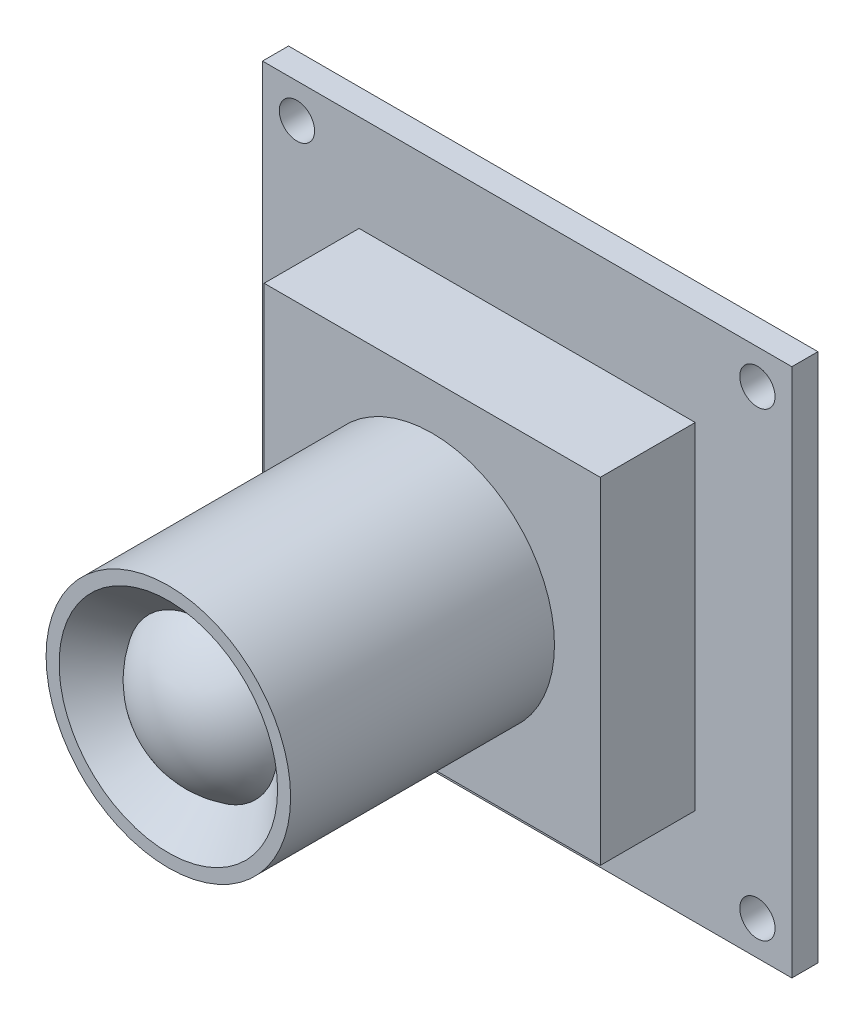
ISO-10303-21;
HEADER;
FILE_DESCRIPTION(('STEP AP214'),'2;1');
FILE_NAME('part.step','',(''),(''),'','','');
FILE_SCHEMA(('AUTOMOTIVE_DESIGN { 1 0 10303 214 1 1 1 1 }'));
ENDSEC;
DATA;
#1=APPLICATION_CONTEXT('core data for automotive mechanical design processes');
#2=APPLICATION_PROTOCOL_DEFINITION('international standard','automotive_design',2000,#1);
#3=PRODUCT_CONTEXT('',#1,'mechanical');
#4=PRODUCT('Part','Part','',(#3));
#5=PRODUCT_RELATED_PRODUCT_CATEGORY('part','',(#4));
#6=PRODUCT_DEFINITION_FORMATION('','',#4);
#7=PRODUCT_DEFINITION_CONTEXT('part definition',#1,'design');
#8=PRODUCT_DEFINITION('design','',#6,#7);
#9=PRODUCT_DEFINITION_SHAPE('','',#8);
#10=(LENGTH_UNIT() NAMED_UNIT(*) SI_UNIT(.MILLI.,.METRE.));
#11=(NAMED_UNIT(*) PLANE_ANGLE_UNIT() SI_UNIT($,.RADIAN.));
#12=(NAMED_UNIT(*) SI_UNIT($,.STERADIAN.) SOLID_ANGLE_UNIT());
#13=UNCERTAINTY_MEASURE_WITH_UNIT(LENGTH_MEASURE(1.E-05),#10,'distance_accuracy_value','');
#14=(GEOMETRIC_REPRESENTATION_CONTEXT(3) GLOBAL_UNCERTAINTY_ASSIGNED_CONTEXT((#13)) GLOBAL_UNIT_ASSIGNED_CONTEXT((#10,
#11,#12)) REPRESENTATION_CONTEXT('',''));
#15=CARTESIAN_POINT('',(0.,0.,0.));
#16=DIRECTION('',(0.,0.,1.));
#17=DIRECTION('',(1.,0.,0.));
#18=AXIS2_PLACEMENT_3D('',#15,#16,#17);
#19=CARTESIAN_POINT('',(0.,0.,7.3152));
#20=DIRECTION('',(0.,0.,1.));
#21=DIRECTION('',(1.,0.,0.));
#22=AXIS2_PLACEMENT_3D('',#19,#20,#21);
#23=PLANE('',#22);
#24=DIRECTION('',(0.,1.,0.));
#25=VECTOR('',#24,1.);
#26=CARTESIAN_POINT('',(10.16,10.16,7.3152));
#27=LINE('',#26,#25);
#28=CARTESIAN_POINT('',(10.16,-10.16,7.3152));
#29=VERTEX_POINT('',#28);
#30=CARTESIAN_POINT('',(10.16,10.16,7.3152));
#31=VERTEX_POINT('',#30);
#32=EDGE_CURVE('E121',#29,#31,#27,.T.);
#33=ORIENTED_EDGE('',*,*,#32,.T.);
#34=DIRECTION('',(-1.,0.,0.));
#35=VECTOR('',#34,1.);
#36=CARTESIAN_POINT('',(-10.16,10.16,7.3152));
#37=LINE('',#36,#35);
#38=CARTESIAN_POINT('',(-10.16,10.16,7.3152));
#39=VERTEX_POINT('',#38);
#40=EDGE_CURVE('E110',#31,#39,#37,.T.);
#41=ORIENTED_EDGE('',*,*,#40,.T.);
#42=DIRECTION('',(0.,-1.,0.));
#43=VECTOR('',#42,1.);
#44=CARTESIAN_POINT('',(-10.16,10.16,7.3152));
#45=LINE('',#44,#43);
#46=CARTESIAN_POINT('',(-10.16,-10.16,7.3152));
#47=VERTEX_POINT('',#46);
#48=EDGE_CURVE('E120',#39,#47,#45,.T.);
#49=ORIENTED_EDGE('',*,*,#48,.T.);
#50=DIRECTION('',(1.,0.,0.));
#51=VECTOR('',#50,1.);
#52=CARTESIAN_POINT('',(-10.16,-10.16,7.3152));
#53=LINE('',#52,#51);
#54=EDGE_CURVE('E125',#47,#29,#53,.T.);
#55=ORIENTED_EDGE('',*,*,#54,.T.);
#56=EDGE_LOOP('',(#33,#41,#49,#55));
#57=FACE_BOUND('',#56,.T.);
#58=CARTESIAN_POINT('',(0.,0.,7.3152));
#59=DIRECTION('',(0.,0.,1.));
#60=DIRECTION('',(1.,0.,0.));
#61=AXIS2_PLACEMENT_3D('',#58,#59,#60);
#62=CIRCLE('',#61,7.3914);
#63=CARTESIAN_POINT('',(7.3914,0.,7.3152));
#64=VERTEX_POINT('',#63);
#65=EDGE_CURVE('E165',#64,#64,#62,.T.);
#66=ORIENTED_EDGE('',*,*,#65,.F.);
#67=EDGE_LOOP('',(#66));
#68=FACE_BOUND('',#67,.T.);
#69=ADVANCED_FACE('F35',(#57,#68),#23,.T.);
#70=CARTESIAN_POINT('',(0.,0.,1.5748));
#71=DIRECTION('',(0.,0.,1.));
#72=DIRECTION('',(1.,0.,0.));
#73=AXIS2_PLACEMENT_3D('',#70,#71,#72);
#74=PLANE('',#73);
#75=CARTESIAN_POINT('',(13.9192,-13.9192,1.5748));
#76=DIRECTION('',(0.,0.,1.));
#77=DIRECTION('',(1.,0.,0.));
#78=AXIS2_PLACEMENT_3D('',#75,#76,#77);
#79=CIRCLE('',#78,1.0668);
#80=CARTESIAN_POINT('',(14.986,-13.9192,1.5748));
#81=VERTEX_POINT('',#80);
#82=EDGE_CURVE('E177',#81,#81,#79,.T.);
#83=ORIENTED_EDGE('',*,*,#82,.F.);
#84=EDGE_LOOP('',(#83));
#85=FACE_BOUND('',#84,.T.);
#86=CARTESIAN_POINT('',(13.9192,13.9192,1.5748));
#87=DIRECTION('',(0.,0.,1.));
#88=DIRECTION('',(1.,0.,0.));
#89=AXIS2_PLACEMENT_3D('',#86,#87,#88);
#90=CIRCLE('',#89,1.0668);
#91=CARTESIAN_POINT('',(14.986,13.9192,1.5748));
#92=VERTEX_POINT('',#91);
#93=EDGE_CURVE('E174',#92,#92,#90,.T.);
#94=ORIENTED_EDGE('',*,*,#93,.F.);
#95=EDGE_LOOP('',(#94));
#96=FACE_BOUND('',#95,.T.);
#97=CARTESIAN_POINT('',(-13.9192,-13.9192,1.5748));
#98=DIRECTION('',(0.,0.,1.));
#99=DIRECTION('',(1.,0.,0.));
#100=AXIS2_PLACEMENT_3D('',#97,#98,#99);
#101=CIRCLE('',#100,1.0668);
#102=CARTESIAN_POINT('',(-12.8524,-13.9192,1.5748));
#103=VERTEX_POINT('',#102);
#104=EDGE_CURVE('E170',#103,#103,#101,.T.);
#105=ORIENTED_EDGE('',*,*,#104,.F.);
#106=EDGE_LOOP('',(#105));
#107=FACE_BOUND('',#106,.T.);
#108=CARTESIAN_POINT('',(-13.9192,13.9192,1.5748));
#109=DIRECTION('',(0.,0.,1.));
#110=DIRECTION('',(1.,0.,0.));
#111=AXIS2_PLACEMENT_3D('',#108,#109,#110);
#112=CIRCLE('',#111,1.0668);
#113=CARTESIAN_POINT('',(-12.8524,13.9192,1.5748));
#114=VERTEX_POINT('',#113);
#115=EDGE_CURVE('E166',#114,#114,#112,.T.);
#116=ORIENTED_EDGE('',*,*,#115,.F.);
#117=EDGE_LOOP('',(#116));
#118=FACE_BOUND('',#117,.T.);
#119=DIRECTION('',(0.,1.,0.));
#120=VECTOR('',#119,1.);
#121=CARTESIAN_POINT('',(16.002,16.002,1.5748));
#122=LINE('',#121,#120);
#123=CARTESIAN_POINT('',(16.002,-16.002,1.5748));
#124=VERTEX_POINT('',#123);
#125=CARTESIAN_POINT('',(16.002,16.002,1.5748));
#126=VERTEX_POINT('',#125);
#127=EDGE_CURVE('E143',#124,#126,#122,.T.);
#128=ORIENTED_EDGE('',*,*,#127,.T.);
#129=DIRECTION('',(-1.,0.,0.));
#130=VECTOR('',#129,1.);
#131=CARTESIAN_POINT('',(-16.002,16.002,1.5748));
#132=LINE('',#131,#130);
#133=CARTESIAN_POINT('',(-16.002,16.002,1.5748));
#134=VERTEX_POINT('',#133);
#135=EDGE_CURVE('E88',#126,#134,#132,.T.);
#136=ORIENTED_EDGE('',*,*,#135,.T.);
#137=DIRECTION('',(0.,-1.,0.));
#138=VECTOR('',#137,1.);
#139=CARTESIAN_POINT('',(-16.002,16.002,1.5748));
#140=LINE('',#139,#138);
#141=CARTESIAN_POINT('',(-16.002,-16.002,1.5748));
#142=VERTEX_POINT('',#141);
#143=EDGE_CURVE('E146',#134,#142,#140,.T.);
#144=ORIENTED_EDGE('',*,*,#143,.T.);
#145=DIRECTION('',(1.,0.,0.));
#146=VECTOR('',#145,1.);
#147=CARTESIAN_POINT('',(-16.002,-16.002,1.5748));
#148=LINE('',#147,#146);
#149=EDGE_CURVE('E59',#142,#124,#148,.T.);
#150=ORIENTED_EDGE('',*,*,#149,.T.);
#151=EDGE_LOOP('',(#128,#136,#144,#150));
#152=FACE_BOUND('',#151,.T.);
#153=DIRECTION('',(-1.,0.,0.));
#154=VECTOR('',#153,1.);
#155=CARTESIAN_POINT('',(-10.16,10.16,1.5748));
#156=LINE('',#155,#154);
#157=CARTESIAN_POINT('',(10.16,10.16,1.5748));
#158=VERTEX_POINT('',#157);
#159=CARTESIAN_POINT('',(-10.16,10.16,1.5748));
#160=VERTEX_POINT('',#159);
#161=EDGE_CURVE('E248',#158,#160,#156,.T.);
#162=ORIENTED_EDGE('',*,*,#161,.F.);
#163=DIRECTION('',(0.,1.,0.));
#164=VECTOR('',#163,1.);
#165=CARTESIAN_POINT('',(10.16,10.16,1.5748));
#166=LINE('',#165,#164);
#167=CARTESIAN_POINT('',(10.16,-10.16,1.5748));
#168=VERTEX_POINT('',#167);
#169=EDGE_CURVE('E133',#168,#158,#166,.T.);
#170=ORIENTED_EDGE('',*,*,#169,.F.);
#171=DIRECTION('',(1.,0.,0.));
#172=VECTOR('',#171,1.);
#173=CARTESIAN_POINT('',(-10.16,-10.16,1.5748));
#174=LINE('',#173,#172);
#175=CARTESIAN_POINT('',(-10.16,-10.16,1.5748));
#176=VERTEX_POINT('',#175);
#177=EDGE_CURVE('E129',#176,#168,#174,.T.);
#178=ORIENTED_EDGE('',*,*,#177,.F.);
#179=DIRECTION('',(0.,-1.,0.));
#180=VECTOR('',#179,1.);
#181=CARTESIAN_POINT('',(-10.16,10.16,1.5748));
#182=LINE('',#181,#180);
#183=EDGE_CURVE('E250',#160,#176,#182,.T.);
#184=ORIENTED_EDGE('',*,*,#183,.F.);
#185=EDGE_LOOP('',(#162,#170,#178,#184));
#186=FACE_BOUND('',#185,.T.);
#187=ADVANCED_FACE('F198',(#85,#96,#107,#118,#152,#186),#74,.T.);
#188=CARTESIAN_POINT('',(16.002,16.002,1.5748));
#189=DIRECTION('',(-1.,0.,0.));
#190=DIRECTION('',(0.,0.,1.));
#191=AXIS2_PLACEMENT_3D('',#188,#189,#190);
#192=PLANE('',#191);
#193=DIRECTION('',(0.,1.,0.));
#194=VECTOR('',#193,1.);
#195=CARTESIAN_POINT('',(16.002,16.002,0.));
#196=LINE('',#195,#194);
#197=CARTESIAN_POINT('',(16.002,-16.002,0.));
#198=VERTEX_POINT('',#197);
#199=CARTESIAN_POINT('',(16.002,16.002,0.));
#200=VERTEX_POINT('',#199);
#201=EDGE_CURVE('E135',#198,#200,#196,.T.);
#202=ORIENTED_EDGE('',*,*,#201,.T.);
#203=DIRECTION('',(0.,0.,-1.));
#204=VECTOR('',#203,1.);
#205=CARTESIAN_POINT('',(16.002,16.002,1.5748));
#206=LINE('',#205,#204);
#207=EDGE_CURVE('E160',#126,#200,#206,.T.);
#208=ORIENTED_EDGE('',*,*,#207,.F.);
#209=ORIENTED_EDGE('',*,*,#127,.F.);
#210=DIRECTION('',(0.,0.,-1.));
#211=VECTOR('',#210,1.);
#212=CARTESIAN_POINT('',(16.002,-16.002,1.5748));
#213=LINE('',#212,#211);
#214=EDGE_CURVE('E148',#124,#198,#213,.T.);
#215=ORIENTED_EDGE('',*,*,#214,.T.);
#216=EDGE_LOOP('',(#202,#208,#209,#215));
#217=FACE_BOUND('',#216,.T.);
#218=ADVANCED_FACE('F203',(#217),#192,.F.);
#219=CARTESIAN_POINT('',(-16.002,16.002,1.5748));
#220=DIRECTION('',(0.,-1.,0.));
#221=DIRECTION('',(0.,0.,-1.));
#222=AXIS2_PLACEMENT_3D('',#219,#220,#221);
#223=PLANE('',#222);
#224=DIRECTION('',(-1.,0.,0.));
#225=VECTOR('',#224,1.);
#226=CARTESIAN_POINT('',(-16.002,16.002,0.));
#227=LINE('',#226,#225);
#228=CARTESIAN_POINT('',(-16.002,16.002,0.));
#229=VERTEX_POINT('',#228);
#230=EDGE_CURVE('E138',#200,#229,#227,.T.);
#231=ORIENTED_EDGE('',*,*,#230,.T.);
#232=DIRECTION('',(0.,0.,-1.));
#233=VECTOR('',#232,1.);
#234=CARTESIAN_POINT('',(-16.002,16.002,1.5748));
#235=LINE('',#234,#233);
#236=EDGE_CURVE('E157',#134,#229,#235,.T.);
#237=ORIENTED_EDGE('',*,*,#236,.F.);
#238=ORIENTED_EDGE('',*,*,#135,.F.);
#239=ORIENTED_EDGE('',*,*,#207,.T.);
#240=EDGE_LOOP('',(#231,#237,#238,#239));
#241=FACE_BOUND('',#240,.T.);
#242=ADVANCED_FACE('F231',(#241),#223,.F.);
#243=CARTESIAN_POINT('',(-16.002,16.002,1.5748));
#244=DIRECTION('',(1.,0.,0.));
#245=DIRECTION('',(0.,1.,0.));
#246=AXIS2_PLACEMENT_3D('',#243,#244,#245);
#247=PLANE('',#246);
#248=DIRECTION('',(0.,-1.,0.));
#249=VECTOR('',#248,1.);
#250=CARTESIAN_POINT('',(-16.002,16.002,0.));
#251=LINE('',#250,#249);
#252=CARTESIAN_POINT('',(-16.002,-16.002,0.));
#253=VERTEX_POINT('',#252);
#254=EDGE_CURVE('E151',#229,#253,#251,.T.);
#255=ORIENTED_EDGE('',*,*,#254,.T.);
#256=DIRECTION('',(0.,0.,-1.));
#257=VECTOR('',#256,1.);
#258=CARTESIAN_POINT('',(-16.002,-16.002,1.5748));
#259=LINE('',#258,#257);
#260=EDGE_CURVE('E155',#142,#253,#259,.T.);
#261=ORIENTED_EDGE('',*,*,#260,.F.);
#262=ORIENTED_EDGE('',*,*,#143,.F.);
#263=ORIENTED_EDGE('',*,*,#236,.T.);
#264=EDGE_LOOP('',(#255,#261,#262,#263));
#265=FACE_BOUND('',#264,.T.);
#266=ADVANCED_FACE('F228',(#265),#247,.F.);
#267=CARTESIAN_POINT('',(-16.002,-16.002,1.5748));
#268=DIRECTION('',(0.,1.,0.));
#269=DIRECTION('',(0.,0.,1.));
#270=AXIS2_PLACEMENT_3D('',#267,#268,#269);
#271=PLANE('',#270);
#272=DIRECTION('',(1.,0.,0.));
#273=VECTOR('',#272,1.);
#274=CARTESIAN_POINT('',(-16.002,-16.002,0.));
#275=LINE('',#274,#273);
#276=EDGE_CURVE('E80',#253,#198,#275,.T.);
#277=ORIENTED_EDGE('',*,*,#276,.T.);
#278=ORIENTED_EDGE('',*,*,#214,.F.);
#279=ORIENTED_EDGE('',*,*,#149,.F.);
#280=ORIENTED_EDGE('',*,*,#260,.T.);
#281=EDGE_LOOP('',(#277,#278,#279,#280));
#282=FACE_BOUND('',#281,.T.);
#283=ADVANCED_FACE('F224',(#282),#271,.F.);
#284=CARTESIAN_POINT('',(0.,0.,0.));
#285=DIRECTION('',(0.,0.,1.));
#286=DIRECTION('',(1.,0.,0.));
#287=AXIS2_PLACEMENT_3D('',#284,#285,#286);
#288=PLANE('',#287);
#289=CARTESIAN_POINT('',(13.9192,-13.9192,0.));
#290=DIRECTION('',(0.,0.,1.));
#291=DIRECTION('',(1.,0.,0.));
#292=AXIS2_PLACEMENT_3D('',#289,#290,#291);
#293=CIRCLE('',#292,1.0668);
#294=CARTESIAN_POINT('',(14.986,-13.9192,0.));
#295=VERTEX_POINT('',#294);
#296=EDGE_CURVE('E175',#295,#295,#293,.T.);
#297=ORIENTED_EDGE('',*,*,#296,.T.);
#298=EDGE_LOOP('',(#297));
#299=FACE_BOUND('',#298,.T.);
#300=CARTESIAN_POINT('',(13.9192,13.9192,0.));
#301=DIRECTION('',(0.,0.,1.));
#302=DIRECTION('',(1.,0.,0.));
#303=AXIS2_PLACEMENT_3D('',#300,#301,#302);
#304=CIRCLE('',#303,1.0668);
#305=CARTESIAN_POINT('',(14.986,13.9192,0.));
#306=VERTEX_POINT('',#305);
#307=EDGE_CURVE('E171',#306,#306,#304,.T.);
#308=ORIENTED_EDGE('',*,*,#307,.T.);
#309=EDGE_LOOP('',(#308));
#310=FACE_BOUND('',#309,.T.);
#311=CARTESIAN_POINT('',(-13.9192,-13.9192,0.));
#312=DIRECTION('',(0.,0.,1.));
#313=DIRECTION('',(1.,0.,0.));
#314=AXIS2_PLACEMENT_3D('',#311,#312,#313);
#315=CIRCLE('',#314,1.0668);
#316=CARTESIAN_POINT('',(-12.8524,-13.9192,0.));
#317=VERTEX_POINT('',#316);
#318=EDGE_CURVE('E167',#317,#317,#315,.T.);
#319=ORIENTED_EDGE('',*,*,#318,.T.);
#320=EDGE_LOOP('',(#319));
#321=FACE_BOUND('',#320,.T.);
#322=CARTESIAN_POINT('',(-13.9192,13.9192,0.));
#323=DIRECTION('',(0.,0.,1.));
#324=DIRECTION('',(1.,0.,0.));
#325=AXIS2_PLACEMENT_3D('',#322,#323,#324);
#326=CIRCLE('',#325,1.0668);
#327=CARTESIAN_POINT('',(-12.8524,13.9192,0.));
#328=VERTEX_POINT('',#327);
#329=EDGE_CURVE('E162',#328,#328,#326,.T.);
#330=ORIENTED_EDGE('',*,*,#329,.T.);
#331=EDGE_LOOP('',(#330));
#332=FACE_BOUND('',#331,.T.);
#333=ORIENTED_EDGE('',*,*,#201,.F.);
#334=ORIENTED_EDGE('',*,*,#276,.F.);
#335=ORIENTED_EDGE('',*,*,#254,.F.);
#336=ORIENTED_EDGE('',*,*,#230,.F.);
#337=EDGE_LOOP('',(#333,#334,#335,#336));
#338=FACE_BOUND('',#337,.T.);
#339=ADVANCED_FACE('F220',(#299,#310,#321,#332,#338),#288,.F.);
#340=CARTESIAN_POINT('',(10.16,10.16,7.3152));
#341=DIRECTION('',(-1.,0.,0.));
#342=DIRECTION('',(0.,-1.,0.));
#343=AXIS2_PLACEMENT_3D('',#340,#341,#342);
#344=PLANE('',#343);
#345=ORIENTED_EDGE('',*,*,#169,.T.);
#346=DIRECTION('',(0.,0.,-1.));
#347=VECTOR('',#346,1.);
#348=CARTESIAN_POINT('',(10.16,10.16,7.3152));
#349=LINE('',#348,#347);
#350=EDGE_CURVE('E114',#31,#158,#349,.T.);
#351=ORIENTED_EDGE('',*,*,#350,.F.);
#352=ORIENTED_EDGE('',*,*,#32,.F.);
#353=DIRECTION('',(0.,0.,-1.));
#354=VECTOR('',#353,1.);
#355=CARTESIAN_POINT('',(10.16,-10.16,7.3152));
#356=LINE('',#355,#354);
#357=EDGE_CURVE('E258',#29,#168,#356,.T.);
#358=ORIENTED_EDGE('',*,*,#357,.T.);
#359=EDGE_LOOP('',(#345,#351,#352,#358));
#360=FACE_BOUND('',#359,.T.);
#361=ADVANCED_FACE('F131',(#360),#344,.F.);
#362=CARTESIAN_POINT('',(-10.16,10.16,7.3152));
#363=DIRECTION('',(0.,-1.,0.));
#364=DIRECTION('',(0.,0.,-1.));
#365=AXIS2_PLACEMENT_3D('',#362,#363,#364);
#366=PLANE('',#365);
#367=ORIENTED_EDGE('',*,*,#161,.T.);
#368=DIRECTION('',(0.,0.,-1.));
#369=VECTOR('',#368,1.);
#370=CARTESIAN_POINT('',(-10.16,10.16,7.3152));
#371=LINE('',#370,#369);
#372=EDGE_CURVE('E117',#39,#160,#371,.T.);
#373=ORIENTED_EDGE('',*,*,#372,.F.);
#374=ORIENTED_EDGE('',*,*,#40,.F.);
#375=ORIENTED_EDGE('',*,*,#350,.T.);
#376=EDGE_LOOP('',(#367,#373,#374,#375));
#377=FACE_BOUND('',#376,.T.);
#378=ADVANCED_FACE('F112',(#377),#366,.F.);
#379=CARTESIAN_POINT('',(-10.16,10.16,7.3152));
#380=DIRECTION('',(1.,0.,0.));
#381=DIRECTION('',(0.,1.,0.));
#382=AXIS2_PLACEMENT_3D('',#379,#380,#381);
#383=PLANE('',#382);
#384=ORIENTED_EDGE('',*,*,#183,.T.);
#385=DIRECTION('',(0.,0.,-1.));
#386=VECTOR('',#385,1.);
#387=CARTESIAN_POINT('',(-10.16,-10.16,7.3152));
#388=LINE('',#387,#386);
#389=EDGE_CURVE('E50',#47,#176,#388,.T.);
#390=ORIENTED_EDGE('',*,*,#389,.F.);
#391=ORIENTED_EDGE('',*,*,#48,.F.);
#392=ORIENTED_EDGE('',*,*,#372,.T.);
#393=EDGE_LOOP('',(#384,#390,#391,#392));
#394=FACE_BOUND('',#393,.T.);
#395=ADVANCED_FACE('F213',(#394),#383,.F.);
#396=CARTESIAN_POINT('',(-10.16,-10.16,7.3152));
#397=DIRECTION('',(0.,1.,0.));
#398=DIRECTION('',(0.,0.,1.));
#399=AXIS2_PLACEMENT_3D('',#396,#397,#398);
#400=PLANE('',#399);
#401=ORIENTED_EDGE('',*,*,#177,.T.);
#402=ORIENTED_EDGE('',*,*,#357,.F.);
#403=ORIENTED_EDGE('',*,*,#54,.F.);
#404=ORIENTED_EDGE('',*,*,#389,.T.);
#405=EDGE_LOOP('',(#401,#402,#403,#404));
#406=FACE_BOUND('',#405,.T.);
#407=ADVANCED_FACE('F210',(#406),#400,.F.);
#408=CARTESIAN_POINT('',(0.,0.,23.2664));
#409=DIRECTION('',(0.,0.,-1.));
#410=DIRECTION('',(-1.,0.,0.));
#411=AXIS2_PLACEMENT_3D('',#408,#409,#410);
#412=CYLINDRICAL_SURFACE('',#411,7.3914);
#413=CARTESIAN_POINT('',(0.,0.,23.2664));
#414=DIRECTION('',(0.,0.,1.));
#415=DIRECTION('',(1.,0.,0.));
#416=AXIS2_PLACEMENT_3D('',#413,#414,#415);
#417=CIRCLE('',#416,7.3914);
#418=CARTESIAN_POINT('',(7.3914,0.,23.2664));
#419=VERTEX_POINT('',#418);
#420=EDGE_CURVE('E253',#419,#419,#417,.T.);
#421=ORIENTED_EDGE('',*,*,#420,.F.);
#422=EDGE_LOOP('',(#421));
#423=FACE_BOUND('',#422,.T.);
#424=ORIENTED_EDGE('',*,*,#65,.T.);
#425=EDGE_LOOP('',(#424));
#426=FACE_BOUND('',#425,.T.);
#427=ADVANCED_FACE('F208',(#423,#426),#412,.T.);
#428=CARTESIAN_POINT('',(0.,0.,23.2664));
#429=DIRECTION('',(0.,0.,1.));
#430=DIRECTION('',(1.,0.,0.));
#431=AXIS2_PLACEMENT_3D('',#428,#429,#430);
#432=PLANE('',#431);
#433=CARTESIAN_POINT('',(0.,0.,23.2664));
#434=DIRECTION('',(0.,0.,1.));
#435=DIRECTION('',(1.,0.,0.));
#436=AXIS2_PLACEMENT_3D('',#433,#434,#435);
#437=CIRCLE('',#436,6.60400000000002);
#438=CARTESIAN_POINT('',(6.60400000000002,0.,23.2664));
#439=VERTEX_POINT('',#438);
#440=EDGE_CURVE('E43',#439,#439,#437,.F.);
#441=ORIENTED_EDGE('',*,*,#440,.T.);
#442=EDGE_LOOP('',(#441));
#443=FACE_BOUND('',#442,.T.);
#444=ORIENTED_EDGE('',*,*,#420,.T.);
#445=EDGE_LOOP('',(#444));
#446=FACE_BOUND('',#445,.T.);
#447=ADVANCED_FACE('F181',(#443,#446),#432,.T.);
#448=CARTESIAN_POINT('',(-13.9192,13.9192,-14.3764));
#449=DIRECTION('',(0.,0.,1.));
#450=DIRECTION('',(1.,0.,0.));
#451=AXIS2_PLACEMENT_3D('',#448,#449,#450);
#452=CYLINDRICAL_SURFACE('',#451,1.0668);
#453=ORIENTED_EDGE('',*,*,#115,.T.);
#454=EDGE_LOOP('',(#453));
#455=FACE_BOUND('',#454,.T.);
#456=ORIENTED_EDGE('',*,*,#329,.F.);
#457=EDGE_LOOP('',(#456));
#458=FACE_BOUND('',#457,.T.);
#459=ADVANCED_FACE('F281',(#455,#458),#452,.F.);
#460=CARTESIAN_POINT('',(-13.9192,-13.9192,-14.3764));
#461=DIRECTION('',(0.,0.,1.));
#462=DIRECTION('',(1.,0.,0.));
#463=AXIS2_PLACEMENT_3D('',#460,#461,#462);
#464=CYLINDRICAL_SURFACE('',#463,1.0668);
#465=ORIENTED_EDGE('',*,*,#104,.T.);
#466=EDGE_LOOP('',(#465));
#467=FACE_BOUND('',#466,.T.);
#468=ORIENTED_EDGE('',*,*,#318,.F.);
#469=EDGE_LOOP('',(#468));
#470=FACE_BOUND('',#469,.T.);
#471=ADVANCED_FACE('F284',(#467,#470),#464,.F.);
#472=CARTESIAN_POINT('',(13.9192,13.9192,-14.3764));
#473=DIRECTION('',(0.,0.,1.));
#474=DIRECTION('',(1.,0.,0.));
#475=AXIS2_PLACEMENT_3D('',#472,#473,#474);
#476=CYLINDRICAL_SURFACE('',#475,1.0668);
#477=ORIENTED_EDGE('',*,*,#93,.T.);
#478=EDGE_LOOP('',(#477));
#479=FACE_BOUND('',#478,.T.);
#480=ORIENTED_EDGE('',*,*,#307,.F.);
#481=EDGE_LOOP('',(#480));
#482=FACE_BOUND('',#481,.T.);
#483=ADVANCED_FACE('F194',(#479,#482),#476,.F.);
#484=CARTESIAN_POINT('',(13.9192,-13.9192,-14.3764));
#485=DIRECTION('',(0.,0.,1.));
#486=DIRECTION('',(1.,0.,0.));
#487=AXIS2_PLACEMENT_3D('',#484,#485,#486);
#488=CYLINDRICAL_SURFACE('',#487,1.0668);
#489=ORIENTED_EDGE('',*,*,#82,.T.);
#490=EDGE_LOOP('',(#489));
#491=FACE_BOUND('',#490,.T.);
#492=ORIENTED_EDGE('',*,*,#296,.F.);
#493=EDGE_LOOP('',(#492));
#494=FACE_BOUND('',#493,.T.);
#495=ADVANCED_FACE('F190',(#491,#494),#488,.F.);
#496=CARTESIAN_POINT('',(0.,0.,18.3895999999999));
#497=DIRECTION('',(0.,0.,1.));
#498=DIRECTION('',(1.,0.,0.));
#499=AXIS2_PLACEMENT_3D('',#496,#497,#498);
#500=SPHERICAL_SURFACE('',#499,5.38480000000007);
#501=CARTESIAN_POINT('',(0.,0.,21.2344));
#502=DIRECTION('',(0.,0.,1.));
#503=DIRECTION('',(1.,0.,0.));
#504=AXIS2_PLACEMENT_3D('',#501,#502,#503);
#505=CIRCLE('',#504,4.57200000000004);
#506=CARTESIAN_POINT('',(4.57200000000004,0.,21.2344));
#507=VERTEX_POINT('',#506);
#508=EDGE_CURVE('E11',#507,#507,#505,.T.);
#509=ORIENTED_EDGE('',*,*,#508,.T.);
#510=EDGE_LOOP('',(#509));
#511=FACE_BOUND('',#510,.T.);
#512=ADVANCED_FACE('F37',(#511),#500,.T.);
#513=CARTESIAN_POINT('',(0.,0.,20.4724));
#514=DIRECTION('',(0.,0.,1.));
#515=DIRECTION('',(1.,0.,0.));
#516=AXIS2_PLACEMENT_3D('',#513,#514,#515);
#517=CONICAL_SURFACE('',#516,3.81,0.785398163397443);
#518=ORIENTED_EDGE('',*,*,#440,.F.);
#519=EDGE_LOOP('',(#518));
#520=FACE_BOUND('',#519,.T.);
#521=ORIENTED_EDGE('',*,*,#508,.F.);
#522=EDGE_LOOP('',(#521));
#523=FACE_BOUND('',#522,.T.);
#524=ADVANCED_FACE('F184',(#520,#523),#517,.F.);
#525=CLOSED_SHELL('',(#69,#187,#218,#242,#266,#283,#339,#361,#378,#395,#407,#427,#447,#459,#471,
#483,#495,#512,#524));
#526=MANIFOLD_SOLID_BREP('B2',#525);
#527=ADVANCED_BREP_SHAPE_REPRESENTATION('',(#18,#526),#14);
#528=SHAPE_DEFINITION_REPRESENTATION(#9,#527);
ENDSEC;
END-ISO-10303-21;
